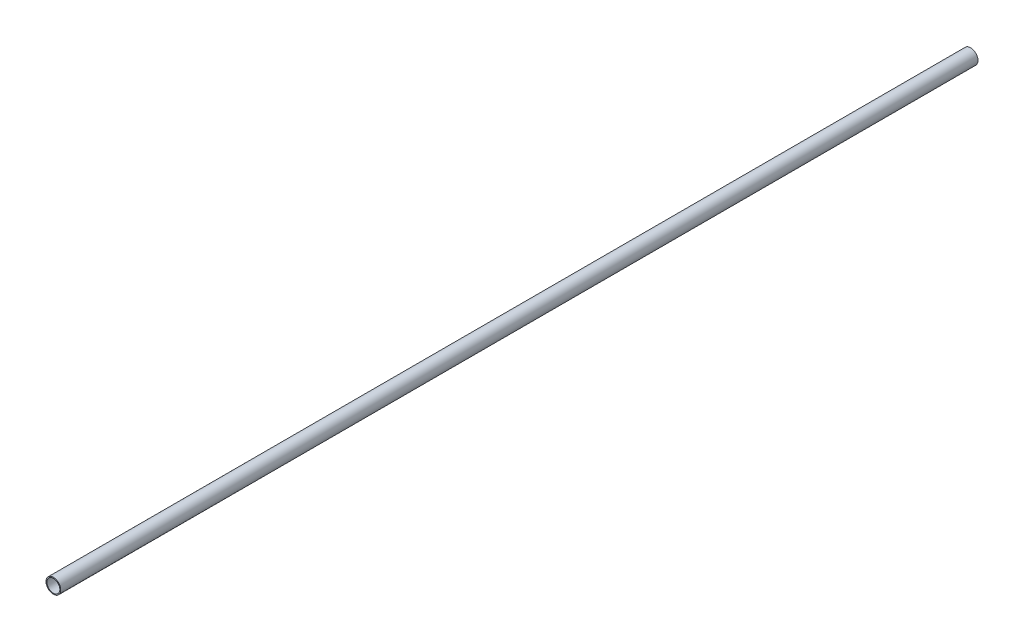
ISO-10303-21;
HEADER;
FILE_DESCRIPTION(('STEP AP214'),'2;1');
FILE_NAME('part.step','',(''),(''),'','','');
FILE_SCHEMA(('AUTOMOTIVE_DESIGN { 1 0 10303 214 1 1 1 1 }'));
ENDSEC;
DATA;
#1=APPLICATION_CONTEXT('core data for automotive mechanical design processes');
#2=APPLICATION_PROTOCOL_DEFINITION('international standard','automotive_design',2000,#1);
#3=PRODUCT_CONTEXT('',#1,'mechanical');
#4=PRODUCT('Part','Part','',(#3));
#5=PRODUCT_RELATED_PRODUCT_CATEGORY('part','',(#4));
#6=PRODUCT_DEFINITION_FORMATION('','',#4);
#7=PRODUCT_DEFINITION_CONTEXT('part definition',#1,'design');
#8=PRODUCT_DEFINITION('design','',#6,#7);
#9=PRODUCT_DEFINITION_SHAPE('','',#8);
#10=(LENGTH_UNIT() NAMED_UNIT(*) SI_UNIT(.MILLI.,.METRE.));
#11=(NAMED_UNIT(*) PLANE_ANGLE_UNIT() SI_UNIT($,.RADIAN.));
#12=(NAMED_UNIT(*) SI_UNIT($,.STERADIAN.) SOLID_ANGLE_UNIT());
#13=UNCERTAINTY_MEASURE_WITH_UNIT(LENGTH_MEASURE(1.E-05),#10,'distance_accuracy_value','');
#14=(GEOMETRIC_REPRESENTATION_CONTEXT(3) GLOBAL_UNCERTAINTY_ASSIGNED_CONTEXT((#13)) GLOBAL_UNIT_ASSIGNED_CONTEXT((#10,
#11,#12)) REPRESENTATION_CONTEXT('',''));
#15=CARTESIAN_POINT('',(0.,0.,0.));
#16=DIRECTION('',(0.,0.,1.));
#17=DIRECTION('',(1.,0.,0.));
#18=AXIS2_PLACEMENT_3D('',#15,#16,#17);
#19=CARTESIAN_POINT('',(2449.7201128805,-5187.00741573402,3000.));
#20=DIRECTION('',(0.,0.,1.));
#21=DIRECTION('',(1.,0.,0.));
#22=AXIS2_PLACEMENT_3D('',#19,#20,#21);
#23=PLANE('',#22);
#24=CARTESIAN_POINT('',(2449.7201128805,-5187.00741573402,3000.));
#25=DIRECTION('',(0.,0.,1.));
#26=DIRECTION('',(1.,0.,0.));
#27=AXIS2_PLACEMENT_3D('',#24,#25,#26);
#28=CIRCLE('',#27,24.125);
#29=CARTESIAN_POINT('',(2473.8451128805,-5187.00741573402,3000.));
#30=VERTEX_POINT('',#29);
#31=EDGE_CURVE('E10',#30,#30,#28,.T.);
#32=ORIENTED_EDGE('',*,*,#31,.T.);
#33=EDGE_LOOP('',(#32));
#34=FACE_BOUND('',#33,.T.);
#35=CARTESIAN_POINT('',(2449.7201128805,-5187.00741573402,3000.));
#36=DIRECTION('',(0.,0.,1.));
#37=DIRECTION('',(1.,0.,0.));
#38=AXIS2_PLACEMENT_3D('',#35,#36,#37);
#39=CIRCLE('',#38,21.0750000000002);
#40=CARTESIAN_POINT('',(2470.7951128805,-5187.00741573402,3000.));
#41=VERTEX_POINT('',#40);
#42=EDGE_CURVE('E43',#41,#41,#39,.T.);
#43=ORIENTED_EDGE('',*,*,#42,.F.);
#44=EDGE_LOOP('',(#43));
#45=FACE_BOUND('',#44,.T.);
#46=ADVANCED_FACE('F32',(#34,#45),#23,.T.);
#47=CARTESIAN_POINT('',(2449.7201128805,-5187.00741573402,0.));
#48=DIRECTION('',(0.,0.,1.));
#49=DIRECTION('',(1.,0.,0.));
#50=AXIS2_PLACEMENT_3D('',#47,#48,#49);
#51=PLANE('',#50);
#52=CARTESIAN_POINT('',(2449.7201128805,-5187.00741573402,0.));
#53=DIRECTION('',(0.,0.,1.));
#54=DIRECTION('',(1.,0.,0.));
#55=AXIS2_PLACEMENT_3D('',#52,#53,#54);
#56=CIRCLE('',#55,24.125);
#57=CARTESIAN_POINT('',(2473.8451128805,-5187.00741573402,0.));
#58=VERTEX_POINT('',#57);
#59=EDGE_CURVE('E36',#58,#58,#56,.T.);
#60=ORIENTED_EDGE('',*,*,#59,.F.);
#61=EDGE_LOOP('',(#60));
#62=FACE_BOUND('',#61,.T.);
#63=CARTESIAN_POINT('',(2449.7201128805,-5187.00741573402,0.));
#64=DIRECTION('',(0.,0.,1.));
#65=DIRECTION('',(1.,0.,0.));
#66=AXIS2_PLACEMENT_3D('',#63,#64,#65);
#67=CIRCLE('',#66,21.0750000000002);
#68=CARTESIAN_POINT('',(2470.7951128805,-5187.00741573402,0.));
#69=VERTEX_POINT('',#68);
#70=EDGE_CURVE('E45',#69,#69,#67,.T.);
#71=ORIENTED_EDGE('',*,*,#70,.T.);
#72=EDGE_LOOP('',(#71));
#73=FACE_BOUND('',#72,.T.);
#74=ADVANCED_FACE('F55',(#62,#73),#51,.F.);
#75=CARTESIAN_POINT('',(2449.7201128805,-5187.00741573402,3000.));
#76=DIRECTION('',(0.,0.,-1.));
#77=DIRECTION('',(-1.,0.,0.));
#78=AXIS2_PLACEMENT_3D('',#75,#76,#77);
#79=CYLINDRICAL_SURFACE('',#78,24.125);
#80=ORIENTED_EDGE('',*,*,#31,.F.);
#81=EDGE_LOOP('',(#80));
#82=FACE_BOUND('',#81,.T.);
#83=ORIENTED_EDGE('',*,*,#59,.T.);
#84=EDGE_LOOP('',(#83));
#85=FACE_BOUND('',#84,.T.);
#86=ADVANCED_FACE('F34',(#82,#85),#79,.T.);
#87=CARTESIAN_POINT('',(2449.7201128805,-5187.00741573402,3000.));
#88=DIRECTION('',(0.,0.,-1.));
#89=DIRECTION('',(-1.,0.,0.));
#90=AXIS2_PLACEMENT_3D('',#87,#88,#89);
#91=CYLINDRICAL_SURFACE('',#90,21.0750000000002);
#92=ORIENTED_EDGE('',*,*,#42,.T.);
#93=EDGE_LOOP('',(#92));
#94=FACE_BOUND('',#93,.T.);
#95=ORIENTED_EDGE('',*,*,#70,.F.);
#96=EDGE_LOOP('',(#95));
#97=FACE_BOUND('',#96,.T.);
#98=ADVANCED_FACE('F51',(#94,#97),#91,.F.);
#99=CLOSED_SHELL('',(#46,#74,#86,#98));
#100=MANIFOLD_SOLID_BREP('B2',#99);
#101=ADVANCED_BREP_SHAPE_REPRESENTATION('',(#18,#100),#14);
#102=SHAPE_DEFINITION_REPRESENTATION(#9,#101);
ENDSEC;
END-ISO-10303-21;
